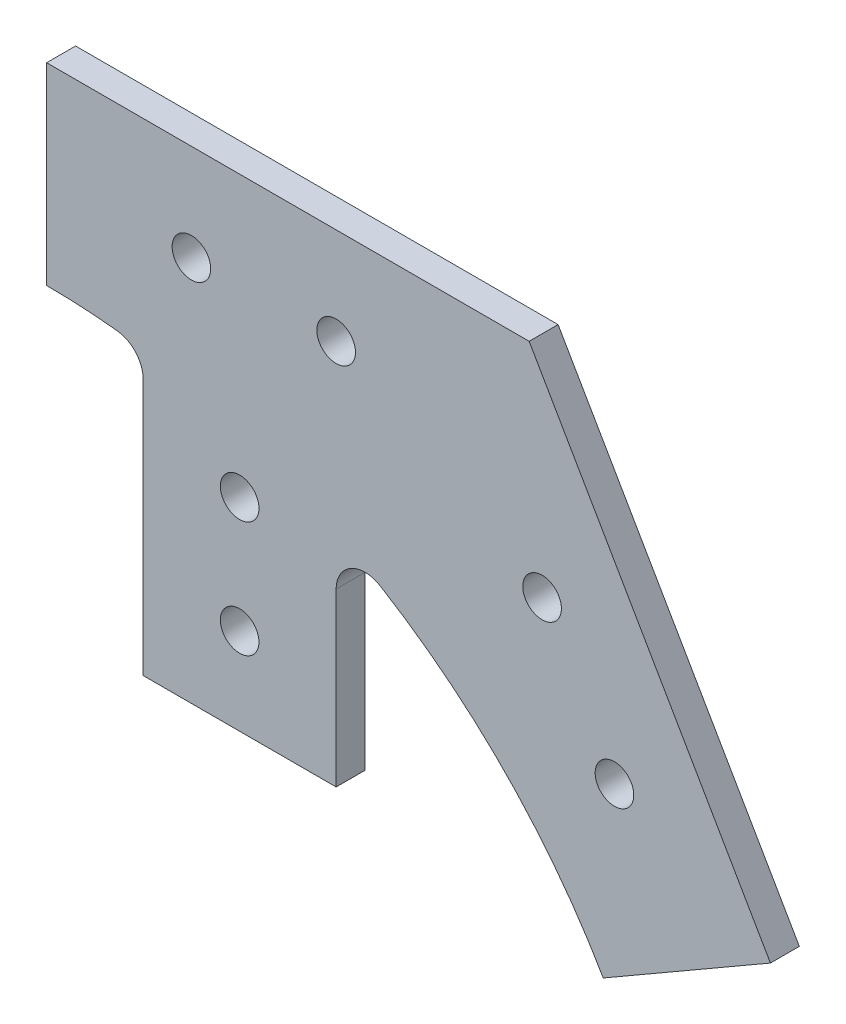
ISO-10303-21;
HEADER;
FILE_DESCRIPTION(('STEP AP214'),'2;1');
FILE_NAME('part.step','',(''),(''),'','','');
FILE_SCHEMA(('AUTOMOTIVE_DESIGN { 1 0 10303 214 1 1 1 1 }'));
ENDSEC;
DATA;
#1=APPLICATION_CONTEXT('core data for automotive mechanical design processes');
#2=APPLICATION_PROTOCOL_DEFINITION('international standard','automotive_design',2000,#1);
#3=PRODUCT_CONTEXT('',#1,'mechanical');
#4=PRODUCT('Part','Part','',(#3));
#5=PRODUCT_RELATED_PRODUCT_CATEGORY('part','',(#4));
#6=PRODUCT_DEFINITION_FORMATION('','',#4);
#7=PRODUCT_DEFINITION_CONTEXT('part definition',#1,'design');
#8=PRODUCT_DEFINITION('design','',#6,#7);
#9=PRODUCT_DEFINITION_SHAPE('','',#8);
#10=(LENGTH_UNIT() NAMED_UNIT(*) SI_UNIT(.MILLI.,.METRE.));
#11=(NAMED_UNIT(*) PLANE_ANGLE_UNIT() SI_UNIT($,.RADIAN.));
#12=(NAMED_UNIT(*) SI_UNIT($,.STERADIAN.) SOLID_ANGLE_UNIT());
#13=UNCERTAINTY_MEASURE_WITH_UNIT(LENGTH_MEASURE(1.E-05),#10,'distance_accuracy_value','');
#14=(GEOMETRIC_REPRESENTATION_CONTEXT(3) GLOBAL_UNCERTAINTY_ASSIGNED_CONTEXT((#13)) GLOBAL_UNIT_ASSIGNED_CONTEXT((#10,
#11,#12)) REPRESENTATION_CONTEXT('',''));
#15=CARTESIAN_POINT('',(0.,0.,0.));
#16=DIRECTION('',(0.,0.,1.));
#17=DIRECTION('',(1.,0.,0.));
#18=AXIS2_PLACEMENT_3D('',#15,#16,#17);
#19=CARTESIAN_POINT('',(-25.3244407561282,-1.35309758072127,3.));
#20=DIRECTION('',(0.,0.,1.));
#21=DIRECTION('',(1.,0.,0.));
#22=AXIS2_PLACEMENT_3D('',#19,#20,#21);
#23=PLANE('',#22);
#24=CARTESIAN_POINT('',(-12.3244407561282,-18.9667192385128,3.));
#25=DIRECTION('',(0.,0.,1.));
#26=DIRECTION('',(1.,0.,0.));
#27=AXIS2_PLACEMENT_3D('',#24,#25,#26);
#28=CIRCLE('',#27,2.);
#29=CARTESIAN_POINT('',(-10.3244407561282,-18.9667192385128,3.));
#30=VERTEX_POINT('',#29);
#31=EDGE_CURVE('E329',#30,#30,#28,.T.);
#32=ORIENTED_EDGE('',*,*,#31,.F.);
#33=EDGE_LOOP('',(#32));
#34=FACE_BOUND('',#33,.T.);
#35=CARTESIAN_POINT('',(19.0153052060276,-0.287227314201777,3.));
#36=DIRECTION('',(0.,0.,1.));
#37=DIRECTION('',(1.,0.,0.));
#38=AXIS2_PLACEMENT_3D('',#35,#36,#37);
#39=CIRCLE('',#38,2.);
#40=CARTESIAN_POINT('',(21.0153052060276,-0.287227314201777,3.));
#41=VERTEX_POINT('',#40);
#42=EDGE_CURVE('E345',#41,#41,#39,.T.);
#43=ORIENTED_EDGE('',*,*,#42,.F.);
#44=EDGE_LOOP('',(#43));
#45=FACE_BOUND('',#44,.T.);
#46=CARTESIAN_POINT('',(-17.324440756128,12.0332807614872,3.));
#47=DIRECTION('',(0.,0.,1.));
#48=DIRECTION('',(1.,0.,0.));
#49=AXIS2_PLACEMENT_3D('',#46,#47,#48);
#50=CIRCLE('',#49,2.);
#51=CARTESIAN_POINT('',(-15.324440756128,12.0332807614872,3.));
#52=VERTEX_POINT('',#51);
#53=EDGE_CURVE('E170',#52,#52,#50,.T.);
#54=ORIENTED_EDGE('',*,*,#53,.F.);
#55=EDGE_LOOP('',(#54));
#56=FACE_BOUND('',#55,.T.);
#57=CARTESIAN_POINT('',(-25.3244407561282,-1.35309758072127,3.));
#58=DIRECTION('',(0.,0.,-1.));
#59=DIRECTION('',(1.,0.,0.));
#60=AXIS2_PLACEMENT_3D('',#57,#58,#59);
#61=CIRCLE('',#60,3.00000000000002);
#62=CARTESIAN_POINT('',(-24.9942652651014,1.62867775372728,3.));
#63=VERTEX_POINT('',#62);
#64=CARTESIAN_POINT('',(-22.3244407561282,-1.35309758072127,3.));
#65=VERTEX_POINT('',#64);
#66=EDGE_CURVE('E197',#63,#65,#61,.T.);
#67=ORIENTED_EDGE('',*,*,#66,.T.);
#68=DIRECTION('',(0.,-1.,0.));
#69=VECTOR('',#68,1.);
#70=CARTESIAN_POINT('',(-22.3244407561282,-1.35309758072127,3.));
#71=LINE('',#70,#69);
#72=CARTESIAN_POINT('',(-22.3244407561282,-27.9667192385128,3.));
#73=VERTEX_POINT('',#72);
#74=EDGE_CURVE('E115',#65,#73,#71,.T.);
#75=ORIENTED_EDGE('',*,*,#74,.T.);
#76=DIRECTION('',(1.,0.,0.));
#77=VECTOR('',#76,1.);
#78=CARTESIAN_POINT('',(-22.3244407561282,-27.9667192385128,3.));
#79=LINE('',#78,#77);
#80=CARTESIAN_POINT('',(-2.3244407561282,-27.9667192385128,3.));
#81=VERTEX_POINT('',#80);
#82=EDGE_CURVE('E230',#73,#81,#79,.T.);
#83=ORIENTED_EDGE('',*,*,#82,.T.);
#84=DIRECTION('',(0.,1.,0.));
#85=VECTOR('',#84,1.);
#86=CARTESIAN_POINT('',(-2.3244407561282,-27.9667192385128,3.));
#87=LINE('',#86,#85);
#88=CARTESIAN_POINT('',(-2.32444075612826,-10.1975469108853,3.));
#89=VERTEX_POINT('',#88);
#90=EDGE_CURVE('E250',#81,#89,#87,.T.);
#91=ORIENTED_EDGE('',*,*,#90,.T.);
#92=CARTESIAN_POINT('',(0.675559243871804,-10.1975469108853,3.));
#93=DIRECTION('',(0.,0.,-1.));
#94=DIRECTION('',(1.,0.,0.));
#95=AXIS2_PLACEMENT_3D('',#92,#93,#94);
#96=CIRCLE('',#95,3.00000000000006);
#97=CARTESIAN_POINT('',(2.23210084442643,-7.63294591935781,3.));
#98=VERTEX_POINT('',#97);
#99=EDGE_CURVE('E246',#89,#98,#96,.T.);
#100=ORIENTED_EDGE('',*,*,#99,.T.);
#101=CARTESIAN_POINT('',(-32.324440756128,-64.5692596169568,3.));
#102=DIRECTION('',(0.,0.,-1.));
#103=DIRECTION('',(1.,0.,0.));
#104=AXIS2_PLACEMENT_3D('',#101,#102,#103);
#105=CIRCLE('',#104,66.6025403784439);
#106=CARTESIAN_POINT('',(25.3550511681832,-31.2679894277348,3.));
#107=VERTEX_POINT('',#106);
#108=EDGE_CURVE('E249',#98,#107,#105,.T.);
#109=ORIENTED_EDGE('',*,*,#108,.T.);
#110=DIRECTION('',(0.866025403784437,0.500000000000002,0.));
#111=VECTOR('',#110,1.);
#112=CARTESIAN_POINT('',(25.3550511681832,-31.2679894277348,3.));
#113=LINE('',#112,#111);
#114=CARTESIAN_POINT('',(42.6755592438719,-21.2679894277348,3.));
#115=VERTEX_POINT('',#114);
#116=EDGE_CURVE('E254',#107,#115,#113,.T.);
#117=ORIENTED_EDGE('',*,*,#116,.T.);
#118=DIRECTION('',(-0.499999999999998,0.86602540378444,0.));
#119=VECTOR('',#118,1.);
#120=CARTESIAN_POINT('',(42.6755592438719,-21.2679894277348,3.));
#121=LINE('',#120,#119);
#122=CARTESIAN_POINT('',(17.675559243872,22.0332807614873,3.));
#123=VERTEX_POINT('',#122);
#124=EDGE_CURVE('E143',#115,#123,#121,.T.);
#125=ORIENTED_EDGE('',*,*,#124,.T.);
#126=DIRECTION('',(-1.,0.,0.));
#127=VECTOR('',#126,1.);
#128=CARTESIAN_POINT('',(17.675559243872,22.0332807614873,3.));
#129=LINE('',#128,#127);
#130=CARTESIAN_POINT('',(-32.324440756128,22.0332807614873,3.));
#131=VERTEX_POINT('',#130);
#132=EDGE_CURVE('E137',#123,#131,#129,.T.);
#133=ORIENTED_EDGE('',*,*,#132,.T.);
#134=DIRECTION('',(0.,-1.,0.));
#135=VECTOR('',#134,1.);
#136=CARTESIAN_POINT('',(-32.324440756128,22.0332807614873,3.));
#137=LINE('',#136,#135);
#138=CARTESIAN_POINT('',(-32.324440756128,2.03328076148716,3.));
#139=VERTEX_POINT('',#138);
#140=EDGE_CURVE('E141',#131,#139,#137,.T.);
#141=ORIENTED_EDGE('',*,*,#140,.T.);
#142=CARTESIAN_POINT('',(-32.324440756128,-64.5692596169568,3.));
#143=DIRECTION('',(0.,0.,-1.));
#144=DIRECTION('',(1.,0.,0.));
#145=AXIS2_PLACEMENT_3D('',#142,#143,#144);
#146=CIRCLE('',#145,66.602540378444);
#147=EDGE_CURVE('E63',#139,#63,#146,.T.);
#148=ORIENTED_EDGE('',*,*,#147,.T.);
#149=EDGE_LOOP('',(#67,#75,#83,#91,#100,#109,#117,#125,#133,#141,#148));
#150=FACE_BOUND('',#149,.T.);
#151=CARTESIAN_POINT('',(-2.32444075612798,12.0332807614872,3.));
#152=DIRECTION('',(0.,0.,1.));
#153=DIRECTION('',(1.,0.,0.));
#154=AXIS2_PLACEMENT_3D('',#151,#152,#153);
#155=CIRCLE('',#154,1.99999999999997);
#156=CARTESIAN_POINT('',(-0.324440756128007,12.0332807614872,3.));
#157=VERTEX_POINT('',#156);
#158=EDGE_CURVE('E353',#157,#157,#155,.T.);
#159=ORIENTED_EDGE('',*,*,#158,.F.);
#160=EDGE_LOOP('',(#159));
#161=FACE_BOUND('',#160,.T.);
#162=CARTESIAN_POINT('',(26.5153052060276,-13.2776083709683,3.));
#163=DIRECTION('',(0.,0.,1.));
#164=DIRECTION('',(1.,0.,0.));
#165=AXIS2_PLACEMENT_3D('',#162,#163,#164);
#166=CIRCLE('',#165,2.);
#167=CARTESIAN_POINT('',(28.5153052060276,-13.2776083709683,3.));
#168=VERTEX_POINT('',#167);
#169=EDGE_CURVE('E337',#168,#168,#166,.T.);
#170=ORIENTED_EDGE('',*,*,#169,.F.);
#171=EDGE_LOOP('',(#170));
#172=FACE_BOUND('',#171,.T.);
#173=CARTESIAN_POINT('',(-12.3244407561282,-6.96671923851278,3.));
#174=DIRECTION('',(0.,0.,1.));
#175=DIRECTION('',(1.,0.,0.));
#176=AXIS2_PLACEMENT_3D('',#173,#174,#175);
#177=CIRCLE('',#176,2.);
#178=CARTESIAN_POINT('',(-10.3244407561282,-6.96671923851278,3.));
#179=VERTEX_POINT('',#178);
#180=EDGE_CURVE('E318',#179,#179,#177,.T.);
#181=ORIENTED_EDGE('',*,*,#180,.F.);
#182=EDGE_LOOP('',(#181));
#183=FACE_BOUND('',#182,.T.);
#184=ADVANCED_FACE('F45',(#34,#45,#56,#150,#161,#172,#183),#23,.T.);
#185=CARTESIAN_POINT('',(-25.3244407561282,-1.35309758072127,0.));
#186=DIRECTION('',(0.,0.,1.));
#187=DIRECTION('',(1.,0.,0.));
#188=AXIS2_PLACEMENT_3D('',#185,#186,#187);
#189=PLANE('',#188);
#190=CARTESIAN_POINT('',(-25.3244407561282,-1.35309758072127,0.));
#191=DIRECTION('',(0.,0.,-1.));
#192=DIRECTION('',(1.,0.,0.));
#193=AXIS2_PLACEMENT_3D('',#190,#191,#192);
#194=CIRCLE('',#193,3.00000000000002);
#195=CARTESIAN_POINT('',(-24.9942652651014,1.62867775372728,0.));
#196=VERTEX_POINT('',#195);
#197=CARTESIAN_POINT('',(-22.3244407561282,-1.35309758072127,0.));
#198=VERTEX_POINT('',#197);
#199=EDGE_CURVE('E165',#196,#198,#194,.T.);
#200=ORIENTED_EDGE('',*,*,#199,.F.);
#201=CARTESIAN_POINT('',(-32.324440756128,-64.5692596169568,0.));
#202=DIRECTION('',(0.,0.,-1.));
#203=DIRECTION('',(1.,0.,0.));
#204=AXIS2_PLACEMENT_3D('',#201,#202,#203);
#205=CIRCLE('',#204,66.602540378444);
#206=CARTESIAN_POINT('',(-32.324440756128,2.03328076148716,0.));
#207=VERTEX_POINT('',#206);
#208=EDGE_CURVE('E107',#207,#196,#205,.T.);
#209=ORIENTED_EDGE('',*,*,#208,.F.);
#210=DIRECTION('',(0.,-1.,0.));
#211=VECTOR('',#210,1.);
#212=CARTESIAN_POINT('',(-32.324440756128,22.0332807614873,0.));
#213=LINE('',#212,#211);
#214=CARTESIAN_POINT('',(-32.324440756128,22.0332807614873,0.));
#215=VERTEX_POINT('',#214);
#216=EDGE_CURVE('E101',#215,#207,#213,.T.);
#217=ORIENTED_EDGE('',*,*,#216,.F.);
#218=DIRECTION('',(-1.,0.,0.));
#219=VECTOR('',#218,1.);
#220=CARTESIAN_POINT('',(17.675559243872,22.0332807614873,0.));
#221=LINE('',#220,#219);
#222=CARTESIAN_POINT('',(17.675559243872,22.0332807614873,0.));
#223=VERTEX_POINT('',#222);
#224=EDGE_CURVE('E152',#223,#215,#221,.T.);
#225=ORIENTED_EDGE('',*,*,#224,.F.);
#226=DIRECTION('',(-0.499999999999998,0.86602540378444,0.));
#227=VECTOR('',#226,1.);
#228=CARTESIAN_POINT('',(42.6755592438719,-21.2679894277348,0.));
#229=LINE('',#228,#227);
#230=CARTESIAN_POINT('',(42.6755592438719,-21.2679894277348,0.));
#231=VERTEX_POINT('',#230);
#232=EDGE_CURVE('E188',#231,#223,#229,.T.);
#233=ORIENTED_EDGE('',*,*,#232,.F.);
#234=DIRECTION('',(0.866025403784437,0.500000000000002,0.));
#235=VECTOR('',#234,1.);
#236=CARTESIAN_POINT('',(25.3550511681832,-31.2679894277348,0.));
#237=LINE('',#236,#235);
#238=CARTESIAN_POINT('',(25.3550511681832,-31.2679894277348,0.));
#239=VERTEX_POINT('',#238);
#240=EDGE_CURVE('E185',#239,#231,#237,.T.);
#241=ORIENTED_EDGE('',*,*,#240,.F.);
#242=CARTESIAN_POINT('',(-32.324440756128,-64.5692596169568,0.));
#243=DIRECTION('',(0.,0.,-1.));
#244=DIRECTION('',(1.,0.,0.));
#245=AXIS2_PLACEMENT_3D('',#242,#243,#244);
#246=CIRCLE('',#245,66.6025403784439);
#247=CARTESIAN_POINT('',(2.23210084442643,-7.63294591935781,0.));
#248=VERTEX_POINT('',#247);
#249=EDGE_CURVE('E182',#248,#239,#246,.T.);
#250=ORIENTED_EDGE('',*,*,#249,.F.);
#251=CARTESIAN_POINT('',(0.675559243871804,-10.1975469108853,0.));
#252=DIRECTION('',(0.,0.,-1.));
#253=DIRECTION('',(1.,0.,0.));
#254=AXIS2_PLACEMENT_3D('',#251,#252,#253);
#255=CIRCLE('',#254,3.00000000000006);
#256=CARTESIAN_POINT('',(-2.32444075612826,-10.1975469108853,0.));
#257=VERTEX_POINT('',#256);
#258=EDGE_CURVE('E179',#257,#248,#255,.T.);
#259=ORIENTED_EDGE('',*,*,#258,.F.);
#260=DIRECTION('',(0.,1.,0.));
#261=VECTOR('',#260,1.);
#262=CARTESIAN_POINT('',(-2.3244407561282,-27.9667192385128,0.));
#263=LINE('',#262,#261);
#264=CARTESIAN_POINT('',(-2.3244407561282,-27.9667192385128,0.));
#265=VERTEX_POINT('',#264);
#266=EDGE_CURVE('E176',#265,#257,#263,.T.);
#267=ORIENTED_EDGE('',*,*,#266,.F.);
#268=DIRECTION('',(1.,0.,0.));
#269=VECTOR('',#268,1.);
#270=CARTESIAN_POINT('',(-22.3244407561282,-27.9667192385128,0.));
#271=LINE('',#270,#269);
#272=CARTESIAN_POINT('',(-22.3244407561282,-27.9667192385128,0.));
#273=VERTEX_POINT('',#272);
#274=EDGE_CURVE('E173',#273,#265,#271,.T.);
#275=ORIENTED_EDGE('',*,*,#274,.F.);
#276=DIRECTION('',(0.,-1.,0.));
#277=VECTOR('',#276,1.);
#278=CARTESIAN_POINT('',(-22.3244407561282,-1.35309758072127,0.));
#279=LINE('',#278,#277);
#280=EDGE_CURVE('E169',#198,#273,#279,.T.);
#281=ORIENTED_EDGE('',*,*,#280,.F.);
#282=EDGE_LOOP('',(#200,#209,#217,#225,#233,#241,#250,#259,#267,#275,#281));
#283=FACE_BOUND('',#282,.T.);
#284=CARTESIAN_POINT('',(-17.324440756128,12.0332807614872,0.));
#285=DIRECTION('',(0.,0.,1.));
#286=DIRECTION('',(1.,0.,0.));
#287=AXIS2_PLACEMENT_3D('',#284,#285,#286);
#288=CIRCLE('',#287,2.);
#289=CARTESIAN_POINT('',(-15.324440756128,12.0332807614872,0.));
#290=VERTEX_POINT('',#289);
#291=EDGE_CURVE('E357',#290,#290,#288,.T.);
#292=ORIENTED_EDGE('',*,*,#291,.T.);
#293=EDGE_LOOP('',(#292));
#294=FACE_BOUND('',#293,.T.);
#295=CARTESIAN_POINT('',(-2.32444075612798,12.0332807614872,0.));
#296=DIRECTION('',(0.,0.,1.));
#297=DIRECTION('',(1.,0.,0.));
#298=AXIS2_PLACEMENT_3D('',#295,#296,#297);
#299=CIRCLE('',#298,1.99999999999997);
#300=CARTESIAN_POINT('',(-0.324440756128007,12.0332807614872,0.));
#301=VERTEX_POINT('',#300);
#302=EDGE_CURVE('E349',#301,#301,#299,.T.);
#303=ORIENTED_EDGE('',*,*,#302,.T.);
#304=EDGE_LOOP('',(#303));
#305=FACE_BOUND('',#304,.T.);
#306=CARTESIAN_POINT('',(19.0153052060276,-0.287227314201777,0.));
#307=DIRECTION('',(0.,0.,1.));
#308=DIRECTION('',(1.,0.,0.));
#309=AXIS2_PLACEMENT_3D('',#306,#307,#308);
#310=CIRCLE('',#309,2.);
#311=CARTESIAN_POINT('',(21.0153052060276,-0.287227314201777,0.));
#312=VERTEX_POINT('',#311);
#313=EDGE_CURVE('E341',#312,#312,#310,.T.);
#314=ORIENTED_EDGE('',*,*,#313,.T.);
#315=EDGE_LOOP('',(#314));
#316=FACE_BOUND('',#315,.T.);
#317=CARTESIAN_POINT('',(26.5153052060276,-13.2776083709683,0.));
#318=DIRECTION('',(0.,0.,1.));
#319=DIRECTION('',(1.,0.,0.));
#320=AXIS2_PLACEMENT_3D('',#317,#318,#319);
#321=CIRCLE('',#320,2.);
#322=CARTESIAN_POINT('',(28.5153052060276,-13.2776083709683,0.));
#323=VERTEX_POINT('',#322);
#324=EDGE_CURVE('E333',#323,#323,#321,.T.);
#325=ORIENTED_EDGE('',*,*,#324,.T.);
#326=EDGE_LOOP('',(#325));
#327=FACE_BOUND('',#326,.T.);
#328=CARTESIAN_POINT('',(-12.3244407561282,-18.9667192385128,0.));
#329=DIRECTION('',(0.,0.,1.));
#330=DIRECTION('',(1.,0.,0.));
#331=AXIS2_PLACEMENT_3D('',#328,#329,#330);
#332=CIRCLE('',#331,2.);
#333=CARTESIAN_POINT('',(-10.3244407561282,-18.9667192385128,0.));
#334=VERTEX_POINT('',#333);
#335=EDGE_CURVE('E326',#334,#334,#332,.T.);
#336=ORIENTED_EDGE('',*,*,#335,.T.);
#337=EDGE_LOOP('',(#336));
#338=FACE_BOUND('',#337,.T.);
#339=CARTESIAN_POINT('',(-12.3244407561282,-6.96671923851278,0.));
#340=DIRECTION('',(0.,0.,1.));
#341=DIRECTION('',(1.,0.,0.));
#342=AXIS2_PLACEMENT_3D('',#339,#340,#341);
#343=CIRCLE('',#342,2.);
#344=CARTESIAN_POINT('',(-10.3244407561282,-6.96671923851278,0.));
#345=VERTEX_POINT('',#344);
#346=EDGE_CURVE('E321',#345,#345,#343,.T.);
#347=ORIENTED_EDGE('',*,*,#346,.T.);
#348=EDGE_LOOP('',(#347));
#349=FACE_BOUND('',#348,.T.);
#350=ADVANCED_FACE('F234',(#283,#294,#305,#316,#327,#338,#349),#189,.F.);
#351=CARTESIAN_POINT('',(-25.3244407561282,-1.35309758072127,3.));
#352=DIRECTION('',(0.,0.,-1.));
#353=DIRECTION('',(-1.,0.,0.));
#354=AXIS2_PLACEMENT_3D('',#351,#352,#353);
#355=CYLINDRICAL_SURFACE('',#354,3.00000000000002);
#356=ORIENTED_EDGE('',*,*,#199,.T.);
#357=DIRECTION('',(0.,0.,-1.));
#358=VECTOR('',#357,1.);
#359=CARTESIAN_POINT('',(-22.3244407561282,-1.35309758072127,3.));
#360=LINE('',#359,#358);
#361=EDGE_CURVE('E11',#65,#198,#360,.T.);
#362=ORIENTED_EDGE('',*,*,#361,.F.);
#363=ORIENTED_EDGE('',*,*,#66,.F.);
#364=DIRECTION('',(0.,0.,-1.));
#365=VECTOR('',#364,1.);
#366=CARTESIAN_POINT('',(-24.9942652651014,1.62867775372728,3.));
#367=LINE('',#366,#365);
#368=EDGE_CURVE('E161',#63,#196,#367,.T.);
#369=ORIENTED_EDGE('',*,*,#368,.T.);
#370=EDGE_LOOP('',(#356,#362,#363,#369));
#371=FACE_BOUND('',#370,.T.);
#372=ADVANCED_FACE('F47',(#371),#355,.F.);
#373=CARTESIAN_POINT('',(-22.3244407561282,-1.35309758072127,3.));
#374=DIRECTION('',(1.,0.,0.));
#375=DIRECTION('',(0.,0.,-1.));
#376=AXIS2_PLACEMENT_3D('',#373,#374,#375);
#377=PLANE('',#376);
#378=ORIENTED_EDGE('',*,*,#280,.T.);
#379=DIRECTION('',(0.,0.,-1.));
#380=VECTOR('',#379,1.);
#381=CARTESIAN_POINT('',(-22.3244407561282,-27.9667192385128,3.));
#382=LINE('',#381,#380);
#383=EDGE_CURVE('E55',#73,#273,#382,.T.);
#384=ORIENTED_EDGE('',*,*,#383,.F.);
#385=ORIENTED_EDGE('',*,*,#74,.F.);
#386=ORIENTED_EDGE('',*,*,#361,.T.);
#387=EDGE_LOOP('',(#378,#384,#385,#386));
#388=FACE_BOUND('',#387,.T.);
#389=ADVANCED_FACE('F487',(#388),#377,.F.);
#390=CARTESIAN_POINT('',(-22.3244407561282,-27.9667192385128,3.));
#391=DIRECTION('',(0.,1.,0.));
#392=DIRECTION('',(0.,0.,1.));
#393=AXIS2_PLACEMENT_3D('',#390,#391,#392);
#394=PLANE('',#393);
#395=ORIENTED_EDGE('',*,*,#274,.T.);
#396=DIRECTION('',(0.,0.,-1.));
#397=VECTOR('',#396,1.);
#398=CARTESIAN_POINT('',(-2.3244407561282,-27.9667192385128,3.));
#399=LINE('',#398,#397);
#400=EDGE_CURVE('E220',#81,#265,#399,.T.);
#401=ORIENTED_EDGE('',*,*,#400,.F.);
#402=ORIENTED_EDGE('',*,*,#82,.F.);
#403=ORIENTED_EDGE('',*,*,#383,.T.);
#404=EDGE_LOOP('',(#395,#401,#402,#403));
#405=FACE_BOUND('',#404,.T.);
#406=ADVANCED_FACE('F228',(#405),#394,.F.);
#407=CARTESIAN_POINT('',(-2.3244407561282,-27.9667192385128,3.));
#408=DIRECTION('',(-1.,0.,0.));
#409=DIRECTION('',(0.,0.,1.));
#410=AXIS2_PLACEMENT_3D('',#407,#408,#409);
#411=PLANE('',#410);
#412=ORIENTED_EDGE('',*,*,#266,.T.);
#413=DIRECTION('',(0.,0.,-1.));
#414=VECTOR('',#413,1.);
#415=CARTESIAN_POINT('',(-2.32444075612826,-10.1975469108853,3.));
#416=LINE('',#415,#414);
#417=EDGE_CURVE('E216',#89,#257,#416,.T.);
#418=ORIENTED_EDGE('',*,*,#417,.F.);
#419=ORIENTED_EDGE('',*,*,#90,.F.);
#420=ORIENTED_EDGE('',*,*,#400,.T.);
#421=EDGE_LOOP('',(#412,#418,#419,#420));
#422=FACE_BOUND('',#421,.T.);
#423=ADVANCED_FACE('F240',(#422),#411,.F.);
#424=CARTESIAN_POINT('',(0.675559243871804,-10.1975469108853,3.));
#425=DIRECTION('',(0.,0.,-1.));
#426=DIRECTION('',(-1.,0.,0.));
#427=AXIS2_PLACEMENT_3D('',#424,#425,#426);
#428=CYLINDRICAL_SURFACE('',#427,3.00000000000006);
#429=ORIENTED_EDGE('',*,*,#258,.T.);
#430=DIRECTION('',(0.,0.,-1.));
#431=VECTOR('',#430,1.);
#432=CARTESIAN_POINT('',(2.23210084442643,-7.63294591935781,3.));
#433=LINE('',#432,#431);
#434=EDGE_CURVE('E212',#98,#248,#433,.T.);
#435=ORIENTED_EDGE('',*,*,#434,.F.);
#436=ORIENTED_EDGE('',*,*,#99,.F.);
#437=ORIENTED_EDGE('',*,*,#417,.T.);
#438=EDGE_LOOP('',(#429,#435,#436,#437));
#439=FACE_BOUND('',#438,.T.);
#440=ADVANCED_FACE('F244',(#439),#428,.F.);
#441=CARTESIAN_POINT('',(-32.324440756128,-64.5692596169568,3.));
#442=DIRECTION('',(0.,0.,-1.));
#443=DIRECTION('',(-1.,0.,0.));
#444=AXIS2_PLACEMENT_3D('',#441,#442,#443);
#445=CYLINDRICAL_SURFACE('',#444,66.6025403784439);
#446=ORIENTED_EDGE('',*,*,#249,.T.);
#447=DIRECTION('',(0.,0.,-1.));
#448=VECTOR('',#447,1.);
#449=CARTESIAN_POINT('',(25.3550511681832,-31.2679894277348,3.));
#450=LINE('',#449,#448);
#451=EDGE_CURVE('E208',#107,#239,#450,.T.);
#452=ORIENTED_EDGE('',*,*,#451,.F.);
#453=ORIENTED_EDGE('',*,*,#108,.F.);
#454=ORIENTED_EDGE('',*,*,#434,.T.);
#455=EDGE_LOOP('',(#446,#452,#453,#454));
#456=FACE_BOUND('',#455,.T.);
#457=ADVANCED_FACE('F453',(#456),#445,.F.);
#458=CARTESIAN_POINT('',(25.3550511681832,-31.2679894277348,3.));
#459=DIRECTION('',(-0.500000000000002,0.866025403784437,0.));
#460=DIRECTION('',(-0.866025403784437,-0.500000000000002,0.));
#461=AXIS2_PLACEMENT_3D('',#458,#459,#460);
#462=PLANE('',#461);
#463=ORIENTED_EDGE('',*,*,#240,.T.);
#464=DIRECTION('',(0.,0.,-1.));
#465=VECTOR('',#464,1.);
#466=CARTESIAN_POINT('',(42.6755592438719,-21.2679894277348,3.));
#467=LINE('',#466,#465);
#468=EDGE_CURVE('E204',#115,#231,#467,.T.);
#469=ORIENTED_EDGE('',*,*,#468,.F.);
#470=ORIENTED_EDGE('',*,*,#116,.F.);
#471=ORIENTED_EDGE('',*,*,#451,.T.);
#472=EDGE_LOOP('',(#463,#469,#470,#471));
#473=FACE_BOUND('',#472,.T.);
#474=ADVANCED_FACE('F265',(#473),#462,.F.);
#475=CARTESIAN_POINT('',(42.6755592438719,-21.2679894277348,3.));
#476=DIRECTION('',(-0.86602540378444,-0.499999999999998,0.));
#477=DIRECTION('',(0.499999999999998,-0.86602540378444,0.));
#478=AXIS2_PLACEMENT_3D('',#475,#476,#477);
#479=PLANE('',#478);
#480=ORIENTED_EDGE('',*,*,#232,.T.);
#481=DIRECTION('',(0.,0.,-1.));
#482=VECTOR('',#481,1.);
#483=CARTESIAN_POINT('',(17.675559243872,22.0332807614873,3.));
#484=LINE('',#483,#482);
#485=EDGE_CURVE('E154',#123,#223,#484,.T.);
#486=ORIENTED_EDGE('',*,*,#485,.F.);
#487=ORIENTED_EDGE('',*,*,#124,.F.);
#488=ORIENTED_EDGE('',*,*,#468,.T.);
#489=EDGE_LOOP('',(#480,#486,#487,#488));
#490=FACE_BOUND('',#489,.T.);
#491=ADVANCED_FACE('F269',(#490),#479,.F.);
#492=CARTESIAN_POINT('',(17.675559243872,22.0332807614873,3.));
#493=DIRECTION('',(0.,-1.,0.));
#494=DIRECTION('',(0.,0.,-1.));
#495=AXIS2_PLACEMENT_3D('',#492,#493,#494);
#496=PLANE('',#495);
#497=ORIENTED_EDGE('',*,*,#224,.T.);
#498=DIRECTION('',(0.,0.,-1.));
#499=VECTOR('',#498,1.);
#500=CARTESIAN_POINT('',(-32.324440756128,22.0332807614873,3.));
#501=LINE('',#500,#499);
#502=EDGE_CURVE('E149',#131,#215,#501,.T.);
#503=ORIENTED_EDGE('',*,*,#502,.F.);
#504=ORIENTED_EDGE('',*,*,#132,.F.);
#505=ORIENTED_EDGE('',*,*,#485,.T.);
#506=EDGE_LOOP('',(#497,#503,#504,#505));
#507=FACE_BOUND('',#506,.T.);
#508=ADVANCED_FACE('F150',(#507),#496,.F.);
#509=CARTESIAN_POINT('',(-32.324440756128,22.0332807614873,3.));
#510=DIRECTION('',(1.,0.,0.));
#511=DIRECTION('',(0.,0.,-1.));
#512=AXIS2_PLACEMENT_3D('',#509,#510,#511);
#513=PLANE('',#512);
#514=ORIENTED_EDGE('',*,*,#216,.T.);
#515=DIRECTION('',(0.,0.,-1.));
#516=VECTOR('',#515,1.);
#517=CARTESIAN_POINT('',(-32.324440756128,2.03328076148716,3.));
#518=LINE('',#517,#516);
#519=EDGE_CURVE('E155',#139,#207,#518,.T.);
#520=ORIENTED_EDGE('',*,*,#519,.F.);
#521=ORIENTED_EDGE('',*,*,#140,.F.);
#522=ORIENTED_EDGE('',*,*,#502,.T.);
#523=EDGE_LOOP('',(#514,#520,#521,#522));
#524=FACE_BOUND('',#523,.T.);
#525=ADVANCED_FACE('F157',(#524),#513,.F.);
#526=CARTESIAN_POINT('',(-32.324440756128,-64.5692596169568,3.));
#527=DIRECTION('',(0.,0.,-1.));
#528=DIRECTION('',(-1.,0.,0.));
#529=AXIS2_PLACEMENT_3D('',#526,#527,#528);
#530=CYLINDRICAL_SURFACE('',#529,66.602540378444);
#531=ORIENTED_EDGE('',*,*,#208,.T.);
#532=ORIENTED_EDGE('',*,*,#368,.F.);
#533=ORIENTED_EDGE('',*,*,#147,.F.);
#534=ORIENTED_EDGE('',*,*,#519,.T.);
#535=EDGE_LOOP('',(#531,#532,#533,#534));
#536=FACE_BOUND('',#535,.T.);
#537=ADVANCED_FACE('F273',(#536),#530,.F.);
#538=CARTESIAN_POINT('',(-17.324440756128,12.0332807614872,3.));
#539=DIRECTION('',(0.,0.,-1.));
#540=DIRECTION('',(-1.,0.,0.));
#541=AXIS2_PLACEMENT_3D('',#538,#539,#540);
#542=CYLINDRICAL_SURFACE('',#541,2.);
#543=ORIENTED_EDGE('',*,*,#53,.T.);
#544=EDGE_LOOP('',(#543));
#545=FACE_BOUND('',#544,.T.);
#546=ORIENTED_EDGE('',*,*,#291,.F.);
#547=EDGE_LOOP('',(#546));
#548=FACE_BOUND('',#547,.T.);
#549=ADVANCED_FACE('F275',(#545,#548),#542,.F.);
#550=CARTESIAN_POINT('',(-2.32444075612798,12.0332807614872,3.));
#551=DIRECTION('',(0.,0.,-1.));
#552=DIRECTION('',(-1.,0.,0.));
#553=AXIS2_PLACEMENT_3D('',#550,#551,#552);
#554=CYLINDRICAL_SURFACE('',#553,1.99999999999997);
#555=ORIENTED_EDGE('',*,*,#158,.T.);
#556=EDGE_LOOP('',(#555));
#557=FACE_BOUND('',#556,.T.);
#558=ORIENTED_EDGE('',*,*,#302,.F.);
#559=EDGE_LOOP('',(#558));
#560=FACE_BOUND('',#559,.T.);
#561=ADVANCED_FACE('F281',(#557,#560),#554,.F.);
#562=CARTESIAN_POINT('',(19.0153052060276,-0.287227314201777,3.));
#563=DIRECTION('',(0.,0.,-1.));
#564=DIRECTION('',(-1.,0.,0.));
#565=AXIS2_PLACEMENT_3D('',#562,#563,#564);
#566=CYLINDRICAL_SURFACE('',#565,2.);
#567=ORIENTED_EDGE('',*,*,#42,.T.);
#568=EDGE_LOOP('',(#567));
#569=FACE_BOUND('',#568,.T.);
#570=ORIENTED_EDGE('',*,*,#313,.F.);
#571=EDGE_LOOP('',(#570));
#572=FACE_BOUND('',#571,.T.);
#573=ADVANCED_FACE('F297',(#569,#572),#566,.F.);
#574=CARTESIAN_POINT('',(26.5153052060276,-13.2776083709683,3.));
#575=DIRECTION('',(0.,0.,-1.));
#576=DIRECTION('',(-1.,0.,0.));
#577=AXIS2_PLACEMENT_3D('',#574,#575,#576);
#578=CYLINDRICAL_SURFACE('',#577,2.);
#579=ORIENTED_EDGE('',*,*,#169,.T.);
#580=EDGE_LOOP('',(#579));
#581=FACE_BOUND('',#580,.T.);
#582=ORIENTED_EDGE('',*,*,#324,.F.);
#583=EDGE_LOOP('',(#582));
#584=FACE_BOUND('',#583,.T.);
#585=ADVANCED_FACE('F301',(#581,#584),#578,.F.);
#586=CARTESIAN_POINT('',(-12.3244407561282,-18.9667192385128,3.));
#587=DIRECTION('',(0.,0.,-1.));
#588=DIRECTION('',(-1.,0.,0.));
#589=AXIS2_PLACEMENT_3D('',#586,#587,#588);
#590=CYLINDRICAL_SURFACE('',#589,2.);
#591=ORIENTED_EDGE('',*,*,#31,.T.);
#592=EDGE_LOOP('',(#591));
#593=FACE_BOUND('',#592,.T.);
#594=ORIENTED_EDGE('',*,*,#335,.F.);
#595=EDGE_LOOP('',(#594));
#596=FACE_BOUND('',#595,.T.);
#597=ADVANCED_FACE('F305',(#593,#596),#590,.F.);
#598=CARTESIAN_POINT('',(-12.3244407561282,-6.96671923851278,3.));
#599=DIRECTION('',(0.,0.,-1.));
#600=DIRECTION('',(-1.,0.,0.));
#601=AXIS2_PLACEMENT_3D('',#598,#599,#600);
#602=CYLINDRICAL_SURFACE('',#601,2.);
#603=ORIENTED_EDGE('',*,*,#180,.T.);
#604=EDGE_LOOP('',(#603));
#605=FACE_BOUND('',#604,.T.);
#606=ORIENTED_EDGE('',*,*,#346,.F.);
#607=EDGE_LOOP('',(#606));
#608=FACE_BOUND('',#607,.T.);
#609=ADVANCED_FACE('F309',(#605,#608),#602,.F.);
#610=CLOSED_SHELL('',(#184,#350,#372,#389,#406,#423,#440,#457,#474,#491,#508,#525,#537,#549,
#561,#573,#585,#597,#609));
#611=MANIFOLD_SOLID_BREP('B2',#610);
#612=ADVANCED_BREP_SHAPE_REPRESENTATION('',(#18,#611),#14);
#613=SHAPE_DEFINITION_REPRESENTATION(#9,#612);
ENDSEC;
END-ISO-10303-21;
